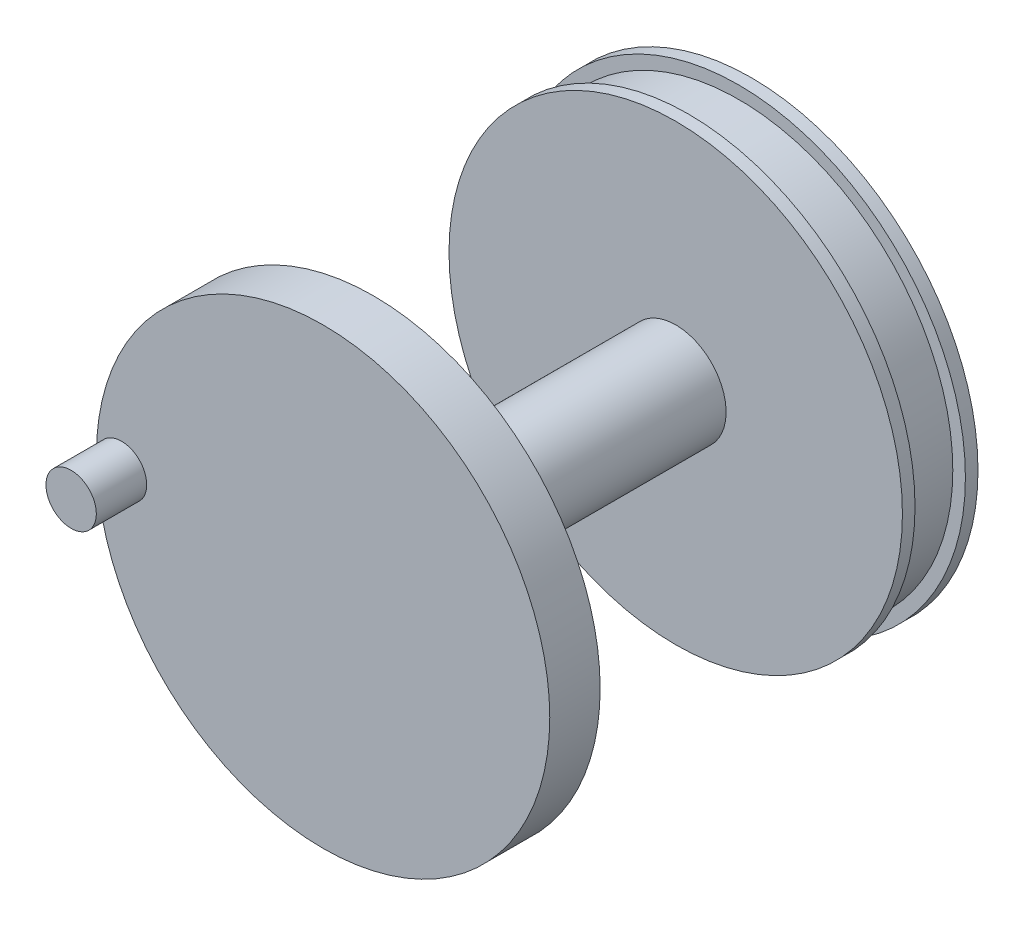
ISO-10303-21;
HEADER;
FILE_DESCRIPTION(('STEP AP214'),'2;1');
FILE_NAME('part.step','',(''),(''),'','','');
FILE_SCHEMA(('AUTOMOTIVE_DESIGN { 1 0 10303 214 1 1 1 1 }'));
ENDSEC;
DATA;
#1=APPLICATION_CONTEXT('core data for automotive mechanical design processes');
#2=APPLICATION_PROTOCOL_DEFINITION('international standard','automotive_design',2000,#1);
#3=PRODUCT_CONTEXT('',#1,'mechanical');
#4=PRODUCT('Part','Part','',(#3));
#5=PRODUCT_RELATED_PRODUCT_CATEGORY('part','',(#4));
#6=PRODUCT_DEFINITION_FORMATION('','',#4);
#7=PRODUCT_DEFINITION_CONTEXT('part definition',#1,'design');
#8=PRODUCT_DEFINITION('design','',#6,#7);
#9=PRODUCT_DEFINITION_SHAPE('','',#8);
#10=(LENGTH_UNIT() NAMED_UNIT(*) SI_UNIT(.MILLI.,.METRE.));
#11=(NAMED_UNIT(*) PLANE_ANGLE_UNIT() SI_UNIT($,.RADIAN.));
#12=(NAMED_UNIT(*) SI_UNIT($,.STERADIAN.) SOLID_ANGLE_UNIT());
#13=UNCERTAINTY_MEASURE_WITH_UNIT(LENGTH_MEASURE(1.E-05),#10,'distance_accuracy_value','');
#14=(GEOMETRIC_REPRESENTATION_CONTEXT(3) GLOBAL_UNCERTAINTY_ASSIGNED_CONTEXT((#13)) GLOBAL_UNIT_ASSIGNED_CONTEXT((#10,
#11,#12)) REPRESENTATION_CONTEXT('',''));
#15=CARTESIAN_POINT('',(0.,0.,0.));
#16=DIRECTION('',(0.,0.,1.));
#17=DIRECTION('',(1.,0.,0.));
#18=AXIS2_PLACEMENT_3D('',#15,#16,#17);
#19=CARTESIAN_POINT('',(0.,0.,-75.));
#20=DIRECTION('',(0.,0.,1.));
#21=DIRECTION('',(1.,0.,0.));
#22=AXIS2_PLACEMENT_3D('',#19,#20,#21);
#23=CYLINDRICAL_SURFACE('',#22,45.);
#24=CARTESIAN_POINT('',(0.,0.,-60.));
#25=DIRECTION('',(0.,0.,-1.));
#26=DIRECTION('',(-1.,0.,0.));
#27=AXIS2_PLACEMENT_3D('',#24,#25,#26);
#28=CIRCLE('',#27,45.);
#29=CARTESIAN_POINT('',(-45.,0.,-60.));
#30=VERTEX_POINT('',#29);
#31=EDGE_CURVE('E62',#30,#30,#28,.T.);
#32=ORIENTED_EDGE('',*,*,#31,.T.);
#33=EDGE_LOOP('',(#32));
#34=FACE_BOUND('',#33,.T.);
#35=CARTESIAN_POINT('',(0.,0.,-62.5));
#36=DIRECTION('',(0.,0.,-1.));
#37=DIRECTION('',(-1.,0.,0.));
#38=AXIS2_PLACEMENT_3D('',#35,#36,#37);
#39=CIRCLE('',#38,45.);
#40=CARTESIAN_POINT('',(-45.,0.,-62.5));
#41=VERTEX_POINT('',#40);
#42=EDGE_CURVE('E65',#41,#41,#39,.T.);
#43=ORIENTED_EDGE('',*,*,#42,.F.);
#44=EDGE_LOOP('',(#43));
#45=FACE_BOUND('',#44,.T.);
#46=ADVANCED_FACE('F34',(#34,#45),#23,.T.);
#47=CARTESIAN_POINT('',(0.,0.,10.));
#48=DIRECTION('',(0.,0.,-1.));
#49=DIRECTION('',(-1.,0.,0.));
#50=AXIS2_PLACEMENT_3D('',#47,#48,#49);
#51=CYLINDRICAL_SURFACE('',#50,45.);
#52=CARTESIAN_POINT('',(0.,0.,10.));
#53=DIRECTION('',(0.,0.,1.));
#54=DIRECTION('',(1.,0.,0.));
#55=AXIS2_PLACEMENT_3D('',#52,#53,#54);
#56=CIRCLE('',#55,45.);
#57=CARTESIAN_POINT('',(-45.,0.,10.));
#58=VERTEX_POINT('',#57);
#59=EDGE_CURVE('E42',#58,#58,#56,.T.);
#60=ORIENTED_EDGE('',*,*,#59,.F.);
#61=EDGE_LOOP('',(#60));
#62=FACE_BOUND('',#61,.T.);
#63=CARTESIAN_POINT('',(0.,0.,0.));
#64=DIRECTION('',(0.,0.,1.));
#65=DIRECTION('',(1.,0.,0.));
#66=AXIS2_PLACEMENT_3D('',#63,#64,#65);
#67=CIRCLE('',#66,45.);
#68=CARTESIAN_POINT('',(45.,0.,0.));
#69=VERTEX_POINT('',#68);
#70=EDGE_CURVE('E38',#69,#69,#67,.T.);
#71=ORIENTED_EDGE('',*,*,#70,.T.);
#72=EDGE_LOOP('',(#71));
#73=FACE_BOUND('',#72,.T.);
#74=ADVANCED_FACE('F36',(#62,#73),#51,.T.);
#75=CARTESIAN_POINT('',(0.,0.,10.));
#76=DIRECTION('',(0.,0.,1.));
#77=DIRECTION('',(1.,0.,0.));
#78=AXIS2_PLACEMENT_3D('',#75,#76,#77);
#79=PLANE('',#78);
#80=ORIENTED_EDGE('',*,*,#59,.T.);
#81=CARTESIAN_POINT('',(-40.,0.,10.));
#82=DIRECTION('',(0.,0.,1.));
#83=DIRECTION('',(1.,0.,0.));
#84=AXIS2_PLACEMENT_3D('',#81,#82,#83);
#85=CIRCLE('',#84,5.);
#86=EDGE_CURVE('E51',#58,#58,#85,.T.);
#87=ORIENTED_EDGE('',*,*,#86,.F.);
#88=EDGE_LOOP('',(#80,#87));
#89=FACE_BOUND('',#88,.T.);
#90=ADVANCED_FACE('F98',(#89),#79,.T.);
#91=CARTESIAN_POINT('',(0.,0.,0.));
#92=DIRECTION('',(0.,0.,1.));
#93=DIRECTION('',(1.,0.,0.));
#94=AXIS2_PLACEMENT_3D('',#91,#92,#93);
#95=PLANE('',#94);
#96=CARTESIAN_POINT('',(0.,0.,0.));
#97=DIRECTION('',(0.,0.,-1.));
#98=DIRECTION('',(-1.,0.,0.));
#99=AXIS2_PLACEMENT_3D('',#96,#97,#98);
#100=CIRCLE('',#99,10.);
#101=CARTESIAN_POINT('',(-10.,0.,0.));
#102=VERTEX_POINT('',#101);
#103=EDGE_CURVE('E11',#102,#102,#100,.T.);
#104=ORIENTED_EDGE('',*,*,#103,.F.);
#105=EDGE_LOOP('',(#104));
#106=FACE_BOUND('',#105,.T.);
#107=ORIENTED_EDGE('',*,*,#70,.F.);
#108=EDGE_LOOP('',(#107));
#109=FACE_BOUND('',#108,.T.);
#110=ADVANCED_FACE('F134',(#106,#109),#95,.F.);
#111=CARTESIAN_POINT('',(-40.,0.,10.));
#112=DIRECTION('',(0.,0.,1.));
#113=DIRECTION('',(1.,0.,0.));
#114=AXIS2_PLACEMENT_3D('',#111,#112,#113);
#115=CYLINDRICAL_SURFACE('',#114,5.);
#116=ORIENTED_EDGE('',*,*,#86,.T.);
#117=EDGE_LOOP('',(#116));
#118=FACE_BOUND('',#117,.T.);
#119=CARTESIAN_POINT('',(-40.,0.,20.));
#120=DIRECTION('',(0.,0.,1.));
#121=DIRECTION('',(1.,0.,0.));
#122=AXIS2_PLACEMENT_3D('',#119,#120,#121);
#123=CIRCLE('',#122,5.);
#124=CARTESIAN_POINT('',(-35.,0.,20.));
#125=VERTEX_POINT('',#124);
#126=EDGE_CURVE('E53',#125,#125,#123,.T.);
#127=ORIENTED_EDGE('',*,*,#126,.F.);
#128=EDGE_LOOP('',(#127));
#129=FACE_BOUND('',#128,.T.);
#130=ADVANCED_FACE('F137',(#118,#129),#115,.T.);
#131=CARTESIAN_POINT('',(-40.,0.,20.));
#132=DIRECTION('',(0.,0.,1.));
#133=DIRECTION('',(1.,0.,0.));
#134=AXIS2_PLACEMENT_3D('',#131,#132,#133);
#135=PLANE('',#134);
#136=ORIENTED_EDGE('',*,*,#126,.T.);
#137=EDGE_LOOP('',(#136));
#138=FACE_BOUND('',#137,.T.);
#139=ADVANCED_FACE('F126',(#138),#135,.T.);
#140=CARTESIAN_POINT('',(0.,0.,-60.));
#141=DIRECTION('',(0.,0.,1.));
#142=DIRECTION('',(1.,0.,0.));
#143=AXIS2_PLACEMENT_3D('',#140,#141,#142);
#144=CYLINDRICAL_SURFACE('',#143,10.);
#145=CARTESIAN_POINT('',(0.,0.,-60.));
#146=DIRECTION('',(0.,0.,-1.));
#147=DIRECTION('',(-1.,0.,0.));
#148=AXIS2_PLACEMENT_3D('',#145,#146,#147);
#149=CIRCLE('',#148,10.);
#150=CARTESIAN_POINT('',(-10.,0.,-60.));
#151=VERTEX_POINT('',#150);
#152=EDGE_CURVE('E56',#151,#151,#149,.T.);
#153=ORIENTED_EDGE('',*,*,#152,.F.);
#154=EDGE_LOOP('',(#153));
#155=FACE_BOUND('',#154,.T.);
#156=ORIENTED_EDGE('',*,*,#103,.T.);
#157=EDGE_LOOP('',(#156));
#158=FACE_BOUND('',#157,.T.);
#159=ADVANCED_FACE('F121',(#155,#158),#144,.T.);
#160=CARTESIAN_POINT('',(0.,0.,-60.));
#161=DIRECTION('',(0.,0.,-1.));
#162=DIRECTION('',(-1.,0.,0.));
#163=AXIS2_PLACEMENT_3D('',#160,#161,#162);
#164=PLANE('',#163);
#165=ORIENTED_EDGE('',*,*,#152,.T.);
#166=EDGE_LOOP('',(#165));
#167=FACE_BOUND('',#166,.T.);
#168=ORIENTED_EDGE('',*,*,#31,.F.);
#169=EDGE_LOOP('',(#168));
#170=FACE_BOUND('',#169,.T.);
#171=ADVANCED_FACE('F87',(#167,#170),#164,.F.);
#172=CARTESIAN_POINT('',(0.,0.,-62.5));
#173=DIRECTION('',(0.,0.,-1.));
#174=DIRECTION('',(-1.,0.,0.));
#175=AXIS2_PLACEMENT_3D('',#172,#173,#174);
#176=PLANE('',#175);
#177=CARTESIAN_POINT('',(0.,0.,-62.5));
#178=DIRECTION('',(0.,0.,-1.));
#179=DIRECTION('',(-1.,0.,0.));
#180=AXIS2_PLACEMENT_3D('',#177,#178,#179);
#181=CIRCLE('',#180,42.5);
#182=CARTESIAN_POINT('',(-42.5,0.,-62.5));
#183=VERTEX_POINT('',#182);
#184=EDGE_CURVE('E71',#183,#183,#181,.T.);
#185=ORIENTED_EDGE('',*,*,#184,.F.);
#186=EDGE_LOOP('',(#185));
#187=FACE_BOUND('',#186,.T.);
#188=ORIENTED_EDGE('',*,*,#42,.T.);
#189=EDGE_LOOP('',(#188));
#190=FACE_BOUND('',#189,.T.);
#191=ADVANCED_FACE('F83',(#187,#190),#176,.T.);
#192=CARTESIAN_POINT('',(0.,0.,-72.5));
#193=DIRECTION('',(0.,0.,-1.));
#194=DIRECTION('',(-1.,0.,0.));
#195=AXIS2_PLACEMENT_3D('',#192,#193,#194);
#196=PLANE('',#195);
#197=CARTESIAN_POINT('',(0.,0.,-72.5));
#198=DIRECTION('',(0.,0.,-1.));
#199=DIRECTION('',(-1.,0.,0.));
#200=AXIS2_PLACEMENT_3D('',#197,#198,#199);
#201=CIRCLE('',#200,42.5);
#202=CARTESIAN_POINT('',(-42.5,0.,-72.5));
#203=VERTEX_POINT('',#202);
#204=EDGE_CURVE('E74',#203,#203,#201,.T.);
#205=ORIENTED_EDGE('',*,*,#204,.T.);
#206=EDGE_LOOP('',(#205));
#207=FACE_BOUND('',#206,.T.);
#208=CARTESIAN_POINT('',(0.,0.,-72.5));
#209=DIRECTION('',(0.,0.,-1.));
#210=DIRECTION('',(-1.,0.,0.));
#211=AXIS2_PLACEMENT_3D('',#208,#209,#210);
#212=CIRCLE('',#211,45.);
#213=CARTESIAN_POINT('',(-45.,0.,-72.5));
#214=VERTEX_POINT('',#213);
#215=EDGE_CURVE('E68',#214,#214,#212,.T.);
#216=ORIENTED_EDGE('',*,*,#215,.F.);
#217=EDGE_LOOP('',(#216));
#218=FACE_BOUND('',#217,.T.);
#219=ADVANCED_FACE('F86',(#207,#218),#196,.F.);
#220=CARTESIAN_POINT('',(0.,0.,-62.5));
#221=DIRECTION('',(0.,0.,-1.));
#222=DIRECTION('',(-1.,0.,0.));
#223=AXIS2_PLACEMENT_3D('',#220,#221,#222);
#224=CYLINDRICAL_SURFACE('',#223,42.5);
#225=ORIENTED_EDGE('',*,*,#184,.T.);
#226=EDGE_LOOP('',(#225));
#227=FACE_BOUND('',#226,.T.);
#228=ORIENTED_EDGE('',*,*,#204,.F.);
#229=EDGE_LOOP('',(#228));
#230=FACE_BOUND('',#229,.T.);
#231=ADVANCED_FACE('F80',(#227,#230),#224,.T.);
#232=CARTESIAN_POINT('',(0.,0.,-75.));
#233=DIRECTION('',(0.,0.,-1.));
#234=DIRECTION('',(-1.,0.,0.));
#235=AXIS2_PLACEMENT_3D('',#232,#233,#234);
#236=PLANE('',#235);
#237=CARTESIAN_POINT('',(0.,0.,-75.));
#238=DIRECTION('',(0.,0.,-1.));
#239=DIRECTION('',(-1.,0.,0.));
#240=AXIS2_PLACEMENT_3D('',#237,#238,#239);
#241=CIRCLE('',#240,45.);
#242=CARTESIAN_POINT('',(-45.,0.,-75.));
#243=VERTEX_POINT('',#242);
#244=EDGE_CURVE('E61',#243,#243,#241,.T.);
#245=ORIENTED_EDGE('',*,*,#244,.T.);
#246=EDGE_LOOP('',(#245));
#247=FACE_BOUND('',#246,.T.);
#248=ADVANCED_FACE('F102',(#247),#236,.T.);
#249=ORIENTED_EDGE('',*,*,#215,.T.);
#250=EDGE_LOOP('',(#249));
#251=FACE_BOUND('',#250,.T.);
#252=ORIENTED_EDGE('',*,*,#244,.F.);
#253=EDGE_LOOP('',(#252));
#254=FACE_BOUND('',#253,.T.);
#255=ADVANCED_FACE('F94',(#251,#254),#23,.T.);
#256=CLOSED_SHELL('',(#46,#74,#90,#110,#130,#139,#159,#171,#191,#219,#231,#248,#255));
#257=MANIFOLD_SOLID_BREP('B2',#256);
#258=ADVANCED_BREP_SHAPE_REPRESENTATION('',(#18,#257),#14);
#259=SHAPE_DEFINITION_REPRESENTATION(#9,#258);
ENDSEC;
END-ISO-10303-21;
